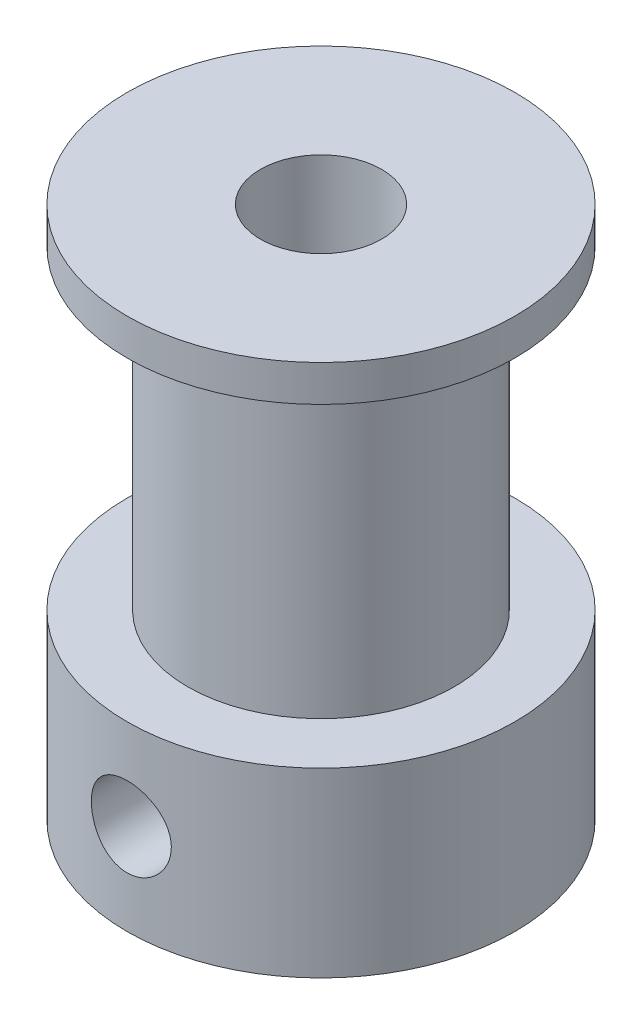
ISO-10303-21;
HEADER;
FILE_DESCRIPTION(('STEP AP214'),'2;1');
FILE_NAME('part.step','',(''),(''),'','','');
FILE_SCHEMA(('AUTOMOTIVE_DESIGN { 1 0 10303 214 1 1 1 1 }'));
ENDSEC;
DATA;
#1=APPLICATION_CONTEXT('core data for automotive mechanical design processes');
#2=APPLICATION_PROTOCOL_DEFINITION('international standard','automotive_design',2000,#1);
#3=PRODUCT_CONTEXT('',#1,'mechanical');
#4=PRODUCT('Part','Part','',(#3));
#5=PRODUCT_RELATED_PRODUCT_CATEGORY('part','',(#4));
#6=PRODUCT_DEFINITION_FORMATION('','',#4);
#7=PRODUCT_DEFINITION_CONTEXT('part definition',#1,'design');
#8=PRODUCT_DEFINITION('design','',#6,#7);
#9=PRODUCT_DEFINITION_SHAPE('','',#8);
#10=(LENGTH_UNIT() NAMED_UNIT(*) SI_UNIT(.MILLI.,.METRE.));
#11=(NAMED_UNIT(*) PLANE_ANGLE_UNIT() SI_UNIT($,.RADIAN.));
#12=(NAMED_UNIT(*) SI_UNIT($,.STERADIAN.) SOLID_ANGLE_UNIT());
#13=UNCERTAINTY_MEASURE_WITH_UNIT(LENGTH_MEASURE(1.E-05),#10,'distance_accuracy_value','');
#14=(GEOMETRIC_REPRESENTATION_CONTEXT(3) GLOBAL_UNCERTAINTY_ASSIGNED_CONTEXT((#13)) GLOBAL_UNIT_ASSIGNED_CONTEXT((#10,
#11,#12)) REPRESENTATION_CONTEXT('',''));
#15=CARTESIAN_POINT('',(0.,0.,0.));
#16=DIRECTION('',(0.,0.,1.));
#17=DIRECTION('',(1.,0.,0.));
#18=AXIS2_PLACEMENT_3D('',#15,#16,#17);
#19=CARTESIAN_POINT('',(0.,0.,0.));
#20=DIRECTION('',(0.,-1.,0.));
#21=DIRECTION('',(0.,0.,-1.));
#22=AXIS2_PLACEMENT_3D('',#19,#20,#21);
#23=CYLINDRICAL_SURFACE('',#22,2.5);
#24=CARTESIAN_POINT('',(-1.8781639970993,3.75,-1.65));
#25=CARTESIAN_POINT('',(-1.87817356740867,3.83079427655975,-1.64999443072167));
#26=CARTESIAN_POINT('',(-1.88347418282792,3.91162636905579,-1.64401449371116));
#27=CARTESIAN_POINT('',(-1.90365752241832,4.07041795060532,-1.62058860250623));
#28=CARTESIAN_POINT('',(-1.9185574504896,4.14837201591593,-1.60312206083479));
#29=CARTESIAN_POINT('',(-1.95530612756548,4.29863333158224,-1.55807727538571));
#30=CARTESIAN_POINT('',(-1.97708883218856,4.37098643150526,-1.53059477126484));
#31=CARTESIAN_POINT('',(-2.02503214275444,4.50994524738078,-1.46657517741326));
#32=CARTESIAN_POINT('',(-2.05119370638084,4.57654970122849,-1.43003610611276));
#33=CARTESIAN_POINT('',(-2.10971828562918,4.71321736687682,-1.342483593019));
#34=CARTESIAN_POINT('',(-2.14241946389367,4.78226727651007,-1.29011420470095));
#35=CARTESIAN_POINT('',(-2.20758221587981,4.91147714614391,-1.17514144468482));
#36=CARTESIAN_POINT('',(-2.24004353252863,4.97162860029669,-1.11252840012499));
#37=CARTESIAN_POINT('',(-2.3064419767716,5.08973271619889,-0.968234915676898));
#38=CARTESIAN_POINT('',(-2.33994640603816,5.14619090363769,-0.885111648041923));
#39=CARTESIAN_POINT('',(-2.39949293751456,5.24384115428655,-0.707908997031479));
#40=CARTESIAN_POINT('',(-2.42554320107045,5.28504992824281,-0.613841755901943));
#41=CARTESIAN_POINT('',(-2.46464353514927,5.34607361226671,-0.428365536633289));
#42=CARTESIAN_POINT('',(-2.47881191391302,5.36774914948944,-0.337811072451694));
#43=CARTESIAN_POINT('',(-2.49700266516609,5.39549014711654,-0.153380704926467));
#44=CARTESIAN_POINT('',(-2.50103745363967,5.40157471024375,-0.0595090091735763));
#45=CARTESIAN_POINT('',(-2.49868729659539,5.39800862462096,0.113712663637896));
#46=CARTESIAN_POINT('',(-2.49376656842582,5.39056933208685,0.193140500290932));
#47=CARTESIAN_POINT('',(-2.47671798966374,5.36453692457822,0.3493383081911));
#48=CARTESIAN_POINT('',(-2.46458960851095,5.3459429885018,0.426108083336214));
#49=CARTESIAN_POINT('',(-2.4341916732427,5.29858528412734,0.574862419576148));
#50=CARTESIAN_POINT('',(-2.41593946394568,5.26985022722838,0.646859815580448));
#51=CARTESIAN_POINT('',(-2.37464804586783,5.20331789592823,0.785017034503281));
#52=CARTESIAN_POINT('',(-2.35160793342518,5.16551891060689,0.851175752075152));
#53=CARTESIAN_POINT('',(-2.29902245001357,5.07644819163509,0.985047000791305));
#54=CARTESIAN_POINT('',(-2.26902056419845,5.02406230137878,1.05183695764555));
#55=CARTESIAN_POINT('',(-2.2070921891754,4.91019022775838,1.17625968695307));
#56=CARTESIAN_POINT('',(-2.17516278943165,4.84869006733423,1.2338781079658));
#57=CARTESIAN_POINT('',(-2.10711048312635,4.70750690257425,1.34724934289721));
#58=CARTESIAN_POINT('',(-2.07108428413496,4.62648069757491,1.40139996434746));
#59=CARTESIAN_POINT('',(-2.00437957659369,4.45447022283534,1.49525229324492));
#60=CARTESIAN_POINT('',(-1.973691925336,4.3635034211415,1.53497883258691));
#61=CARTESIAN_POINT('',(-1.93021206234819,4.20004901179961,1.58906609884216));
#62=CARTESIAN_POINT('',(-1.91481376393407,4.12958306194073,1.60742065844977));
#63=CARTESIAN_POINT('',(-1.89156962487726,3.98568483824098,1.63471528383588));
#64=CARTESIAN_POINT('',(-1.88371114115,3.91225774603094,1.64367111218457));
#65=CARTESIAN_POINT('',(-1.8767563549997,3.76413898103529,1.65161100823904));
#66=CARTESIAN_POINT('',(-1.87769482426888,3.68944345582033,1.65055550398266));
#67=CARTESIAN_POINT('',(-1.88825914723377,3.54146670785288,1.6384550878589));
#68=CARTESIAN_POINT('',(-1.89789215655036,3.46818670082213,1.62740194790476));
#69=CARTESIAN_POINT('',(-1.92377320788271,3.32815606994752,1.59670654181037));
#70=CARTESIAN_POINT('',(-1.9397182942886,3.2612601566981,1.57745493961547));
#71=CARTESIAN_POINT('',(-1.97637475195715,3.13158821030647,1.53127715983157));
#72=CARTESIAN_POINT('',(-1.99708770330354,3.06881355184297,1.50434843731628));
#73=CARTESIAN_POINT('',(-2.04592024038531,2.93584653371123,1.43744371796295));
#74=CARTESIAN_POINT('',(-2.0746933834994,2.86666627761783,1.3959374151933));
#75=CARTESIAN_POINT('',(-2.13386307226145,2.7354540035836,1.30370192953132));
#76=CARTESIAN_POINT('',(-2.16426156090022,2.67343083426984,1.2529615255776));
#77=CARTESIAN_POINT('',(-2.23066104299162,2.54502279309446,1.13132559349666));
#78=CARTESIAN_POINT('',(-2.26650752858329,2.48042825569478,1.0584336843705));
#79=CARTESIAN_POINT('',(-2.33354741548986,2.36429294484174,0.901029136145231));
#80=CARTESIAN_POINT('',(-2.36474520160667,2.31273983785047,0.816527594120796));
#81=CARTESIAN_POINT('',(-2.41383928477658,2.23346296196824,0.655022436944606));
#82=CARTESIAN_POINT('',(-2.43314294605933,2.20305320616478,0.579766982761486));
#83=CARTESIAN_POINT('',(-2.46500344203446,2.15340770004291,0.424305717798088));
#84=CARTESIAN_POINT('',(-2.47756592552064,2.13416259316718,0.344104114697705));
#85=CARTESIAN_POINT('',(-2.49483359194805,2.10780779187866,0.180532057501463));
#86=CARTESIAN_POINT('',(-2.49950622522129,2.10074836698325,0.097149920346795));
#87=CARTESIAN_POINT('',(-2.50041880991432,2.09936521725825,-0.0697703046886511));
#88=CARTESIAN_POINT('',(-2.49665914509096,2.10504091284884,-0.153308385299508));
#89=CARTESIAN_POINT('',(-2.48162224491363,2.12795948175331,-0.312248842068671));
#90=CARTESIAN_POINT('',(-2.47086791156197,2.14439826797345,-0.387820405838241));
#91=CARTESIAN_POINT('',(-2.44325497490618,2.18722616352496,-0.534890956581204));
#92=CARTESIAN_POINT('',(-2.4263954123254,2.21361683656131,-0.606389301510794));
#93=CARTESIAN_POINT('',(-2.38659098522815,2.27725696718865,-0.748299731070004));
#94=CARTESIAN_POINT('',(-2.36333062488106,2.31508395318078,-0.818362050887263));
#95=CARTESIAN_POINT('',(-2.31298664760703,2.39960758414193,-0.951399734920286));
#96=CARTESIAN_POINT('',(-2.2859005630314,2.44630996063965,-1.0143704774724));
#97=CARTESIAN_POINT('',(-2.22528132748969,2.55552907515258,-1.14186276834819));
#98=CARTESIAN_POINT('',(-2.19140310364951,2.61937720174746,-1.20508031729177));
#99=CARTESIAN_POINT('',(-2.12387294022856,2.75656834044152,-1.32046767601713));
#100=CARTESIAN_POINT('',(-2.09022116132146,2.82991747200145,-1.37263030790415));
#101=CARTESIAN_POINT('',(-2.02963185186414,2.97797320198263,-1.46053735742483));
#102=CARTESIAN_POINT('',(-2.00236030827309,3.05189495776457,-1.49736813204505));
#103=CARTESIAN_POINT('',(-1.95397052678841,3.20610913288329,-1.55999123252305));
#104=CARTESIAN_POINT('',(-1.93283919103843,3.28638751989308,-1.58580711054237));
#105=CARTESIAN_POINT('',(-1.90415675714691,3.4306913968137,-1.62004735146957));
#106=CARTESIAN_POINT('',(-1.89451740482451,3.49364690760695,-1.63122690692698));
#107=CARTESIAN_POINT('',(-1.88151889606352,3.62106080182247,-1.64620346660995));
#108=CARTESIAN_POINT('',(-1.8781563590673,3.68551835732424,-1.65000444482246));
#109=CARTESIAN_POINT('',(-1.8781639970993,3.75,-1.65));
#110=B_SPLINE_CURVE_WITH_KNOTS('',3,(#24,#25,#26,#27,#28,#29,#30,#31,#32,#33,#34,#35,#36,#37,
#38,#39,#40,#41,#42,#43,#44,#45,#46,#47,#48,#49,#50,#51,#52,#53,#54,#55,#56,#57,#58,#59,#60,#61,
#62,#63,#64,#65,#66,#67,#68,#69,#70,#71,#72,#73,#74,#75,#76,#77,#78,#79,#80,#81,#82,#83,#84,#85,
#86,#87,#88,#89,#90,#91,#92,#93,#94,#95,#96,#97,#98,#99,#100,#101,#102,#103,#104,#105,#106,#107,
#108,#109),.UNSPECIFIED.,.T.,.F.,(4,2,2,2,2,2,2,2,2,2,2,2,2,2,2,2,2,2,2,2,2,2,2,2,2,2,2,2,2,2,2,
2,2,2,2,2,2,2,2,2,2,2,4),(0.,0.242089089232209,0.484613262365225,0.724877542229117,
0.965194438206265,1.24204242334406,1.5191533550871,1.83517136959404,2.1508420497088,
2.43163690958526,2.71208756281942,2.95071293244789,3.18935586962917,3.42732851395789,
3.66534611375403,3.93440451568683,4.20387988176699,4.51414003592554,4.82386349786489,
5.04625677123859,5.26827647088753,5.49117411610792,5.71425537389902,5.92772322794784,
6.14126192794924,6.39732261532281,6.65369656488882,6.9635657507811,7.27314078239636,
7.52238413686408,7.77141830954321,8.02147738775785,8.27152508592672,8.50474641601316,
8.73800440662634,8.98590102363144,9.23395827408608,9.52089661145361,9.80802068929721,
10.067982581361,10.327385800336,10.5207004402689,10.713910935025),.UNSPECIFIED.);
#111=CARTESIAN_POINT('',(-1.8781639970993,3.75,-1.65));
#112=VERTEX_POINT('',#111);
#113=EDGE_CURVE('E124',#112,#112,#110,.T.);
#114=ORIENTED_EDGE('',*,*,#113,.F.);
#115=EDGE_LOOP('',(#114));
#116=FACE_BOUND('',#115,.T.);
#117=CARTESIAN_POINT('',(-1.64999999999999,3.75,1.8781639970993));
#118=CARTESIAN_POINT('',(-1.64999443072166,3.83079427655975,1.87817356740867));
#119=CARTESIAN_POINT('',(-1.64401449371115,3.91162636905579,1.88347418282793));
#120=CARTESIAN_POINT('',(-1.62058860250622,4.07041795060532,1.90365752241832));
#121=CARTESIAN_POINT('',(-1.60312206083479,4.14837201591593,1.91855745048961));
#122=CARTESIAN_POINT('',(-1.5580772753857,4.29863333158224,1.95530612756548));
#123=CARTESIAN_POINT('',(-1.53059477126484,4.37098643150526,1.97708883218856));
#124=CARTESIAN_POINT('',(-1.46657517741325,4.50994524738078,2.02503214275445));
#125=CARTESIAN_POINT('',(-1.43003610611276,4.57654970122849,2.05119370638085));
#126=CARTESIAN_POINT('',(-1.34248359301899,4.71321736687682,2.10971828562919));
#127=CARTESIAN_POINT('',(-1.29011420470094,4.78226727651007,2.14241946389367));
#128=CARTESIAN_POINT('',(-1.17514144468481,4.91147714614391,2.20758221587982));
#129=CARTESIAN_POINT('',(-1.11252840012498,4.97162860029669,2.24004353252863));
#130=CARTESIAN_POINT('',(-0.968234915676889,5.08973271619889,2.3064419767716));
#131=CARTESIAN_POINT('',(-0.885111648041913,5.14619090363769,2.33994640603817));
#132=CARTESIAN_POINT('',(-0.707908997031469,5.24384115428655,2.39949293751456));
#133=CARTESIAN_POINT('',(-0.613841755901935,5.28504992824281,2.42554320107045));
#134=CARTESIAN_POINT('',(-0.42836553663328,5.34607361226671,2.46464353514927));
#135=CARTESIAN_POINT('',(-0.337811072451686,5.36774914948944,2.47881191391302));
#136=CARTESIAN_POINT('',(-0.153380704926459,5.39549014711654,2.49700266516609));
#137=CARTESIAN_POINT('',(-0.0595090091735682,5.40157471024375,2.50103745363967));
#138=CARTESIAN_POINT('',(0.113712663637904,5.39800862462096,2.49868729659539));
#139=CARTESIAN_POINT('',(0.19314050029094,5.39056933208685,2.49376656842582));
#140=CARTESIAN_POINT('',(0.349338308191108,5.36453692457822,2.47671798966374));
#141=CARTESIAN_POINT('',(0.426108083336222,5.3459429885018,2.46458960851095));
#142=CARTESIAN_POINT('',(0.574862419576156,5.29858528412734,2.4341916732427));
#143=CARTESIAN_POINT('',(0.646859815580457,5.26985022722838,2.41593946394568));
#144=CARTESIAN_POINT('',(0.78501703450329,5.20331789592823,2.37464804586783));
#145=CARTESIAN_POINT('',(0.85117575207516,5.16551891060689,2.35160793342517));
#146=CARTESIAN_POINT('',(0.985047000791313,5.07644819163509,2.29902245001356));
#147=CARTESIAN_POINT('',(1.05183695764556,5.02406230137878,2.26902056419845));
#148=CARTESIAN_POINT('',(1.17625968695308,4.91019022775838,2.20709218917539));
#149=CARTESIAN_POINT('',(1.23387810796581,4.84869006733423,2.17516278943164));
#150=CARTESIAN_POINT('',(1.34724934289721,4.70750690257425,2.10711048312634));
#151=CARTESIAN_POINT('',(1.40139996434747,4.62648069757491,2.07108428413495));
#152=CARTESIAN_POINT('',(1.49525229324493,4.45447022283534,2.00437957659369));
#153=CARTESIAN_POINT('',(1.53497883258691,4.3635034211415,1.973691925336));
#154=CARTESIAN_POINT('',(1.58906609884217,4.20004901179961,1.93021206234819));
#155=CARTESIAN_POINT('',(1.60742065844978,4.12958306194073,1.91481376393406));
#156=CARTESIAN_POINT('',(1.63471528383588,3.98568483824098,1.89156962487725));
#157=CARTESIAN_POINT('',(1.64367111218458,3.91225774603094,1.88371114115));
#158=CARTESIAN_POINT('',(1.65161100823905,3.76413898103529,1.8767563549997));
#159=CARTESIAN_POINT('',(1.65055550398267,3.68944345582033,1.87769482426888));
#160=CARTESIAN_POINT('',(1.63845508785891,3.54146670785288,1.88825914723377));
#161=CARTESIAN_POINT('',(1.62740194790476,3.46818670082213,1.89789215655035));
#162=CARTESIAN_POINT('',(1.59670654181038,3.32815606994752,1.92377320788271));
#163=CARTESIAN_POINT('',(1.57745493961548,3.2612601566981,1.9397182942886));
#164=CARTESIAN_POINT('',(1.53127715983158,3.13158821030647,1.97637475195714));
#165=CARTESIAN_POINT('',(1.50434843731629,3.06881355184297,1.99708770330354));
#166=CARTESIAN_POINT('',(1.43744371796296,2.93584653371123,2.0459202403853));
#167=CARTESIAN_POINT('',(1.39593741519331,2.86666627761783,2.07469338349939));
#168=CARTESIAN_POINT('',(1.30370192953132,2.7354540035836,2.13386307226145));
#169=CARTESIAN_POINT('',(1.25296152557761,2.67343083426984,2.16426156090021));
#170=CARTESIAN_POINT('',(1.13132559349666,2.54502279309446,2.23066104299161));
#171=CARTESIAN_POINT('',(1.0584336843705,2.48042825569478,2.26650752858329));
#172=CARTESIAN_POINT('',(0.901029136145239,2.36429294484174,2.33354741548986));
#173=CARTESIAN_POINT('',(0.816527594120804,2.31273983785047,2.36474520160667));
#174=CARTESIAN_POINT('',(0.655022436944614,2.23346296196824,2.41383928477658));
#175=CARTESIAN_POINT('',(0.579766982761494,2.20305320616478,2.43314294605933));
#176=CARTESIAN_POINT('',(0.424305717798096,2.15340770004291,2.46500344203446));
#177=CARTESIAN_POINT('',(0.344104114697714,2.13416259316718,2.47756592552063));
#178=CARTESIAN_POINT('',(0.180532057501472,2.10780779187866,2.49483359194805));
#179=CARTESIAN_POINT('',(0.097149920346804,2.10074836698325,2.49950622522129));
#180=CARTESIAN_POINT('',(-0.0697703046886418,2.09936521725825,2.50041880991432));
#181=CARTESIAN_POINT('',(-0.153308385299498,2.10504091284884,2.49665914509096));
#182=CARTESIAN_POINT('',(-0.312248842068662,2.12795948175331,2.48162224491364));
#183=CARTESIAN_POINT('',(-0.387820405838232,2.14439826797345,2.47086791156197));
#184=CARTESIAN_POINT('',(-0.534890956581195,2.18722616352496,2.44325497490618));
#185=CARTESIAN_POINT('',(-0.606389301510785,2.21361683656131,2.42639541232541));
#186=CARTESIAN_POINT('',(-0.748299731069995,2.27725696718865,2.38659098522815));
#187=CARTESIAN_POINT('',(-0.818362050887254,2.31508395318078,2.36333062488106));
#188=CARTESIAN_POINT('',(-0.951399734920278,2.39960758414193,2.31298664760704));
#189=CARTESIAN_POINT('',(-1.01437047747239,2.44630996063965,2.2859005630314));
#190=CARTESIAN_POINT('',(-1.14186276834818,2.55552907515258,2.2252813274897));
#191=CARTESIAN_POINT('',(-1.20508031729177,2.61937720174746,2.19140310364951));
#192=CARTESIAN_POINT('',(-1.32046767601712,2.75656834044152,2.12387294022856));
#193=CARTESIAN_POINT('',(-1.37263030790415,2.82991747200145,2.09022116132146));
#194=CARTESIAN_POINT('',(-1.46053735742482,2.97797320198263,2.02963185186414));
#195=CARTESIAN_POINT('',(-1.49736813204505,3.05189495776457,2.00236030827309));
#196=CARTESIAN_POINT('',(-1.55999123252304,3.20610913288329,1.95397052678842));
#197=CARTESIAN_POINT('',(-1.58580711054236,3.28638751989308,1.93283919103844));
#198=CARTESIAN_POINT('',(-1.62004735146956,3.4306913968137,1.90415675714692));
#199=CARTESIAN_POINT('',(-1.63122690692697,3.49364690760695,1.89451740482452));
#200=CARTESIAN_POINT('',(-1.64620346660994,3.62106080182247,1.88151889606352));
#201=CARTESIAN_POINT('',(-1.65000444482246,3.68551835732424,1.87815635906731));
#202=CARTESIAN_POINT('',(-1.64999999999999,3.75,1.8781639970993));
#203=B_SPLINE_CURVE_WITH_KNOTS('',3,(#117,#118,#119,#120,#121,#122,#123,#124,#125,#126,#127,
#128,#129,#130,#131,#132,#133,#134,#135,#136,#137,#138,#139,#140,#141,#142,#143,#144,#145,#146,
#147,#148,#149,#150,#151,#152,#153,#154,#155,#156,#157,#158,#159,#160,#161,#162,#163,#164,#165,
#166,#167,#168,#169,#170,#171,#172,#173,#174,#175,#176,#177,#178,#179,#180,#181,#182,#183,#184,
#185,#186,#187,#188,#189,#190,#191,#192,#193,#194,#195,#196,#197,#198,#199,#200,#201,#202),
.UNSPECIFIED.,.T.,.F.,(4,2,2,2,2,2,2,2,2,2,2,2,2,2,2,2,2,2,2,2,2,2,2,2,2,2,2,2,2,2,2,2,2,2,2,2,
2,2,2,2,2,2,4),(0.,0.242089089232209,0.484613262365225,0.724877542229118,0.965194438206265,
1.24204242334406,1.5191533550871,1.83517136959404,2.1508420497088,2.43163690958526,
2.71208756281942,2.95071293244789,3.18935586962917,3.42732851395789,3.66534611375403,
3.93440451568683,4.20387988176699,4.51414003592554,4.82386349786489,5.04625677123858,
5.26827647088753,5.49117411610791,5.71425537389902,5.92772322794784,6.14126192794924,
6.39732261532281,6.65369656488882,6.9635657507811,7.27314078239636,7.52238413686408,
7.77141830954321,8.02147738775785,8.27152508592672,8.50474641601316,8.73800440662634,
8.98590102363144,9.23395827408608,9.52089661145361,9.80802068929721,10.067982581361,
10.327385800336,10.5207004402689,10.713910935025),.UNSPECIFIED.);
#204=CARTESIAN_POINT('',(-1.64999999999999,3.75,1.8781639970993));
#205=VERTEX_POINT('',#204);
#206=EDGE_CURVE('E66',#205,#205,#203,.T.);
#207=ORIENTED_EDGE('',*,*,#206,.F.);
#208=EDGE_LOOP('',(#207));
#209=FACE_BOUND('',#208,.T.);
#210=CARTESIAN_POINT('',(0.,0.,0.));
#211=DIRECTION('',(0.,-1.,0.));
#212=DIRECTION('',(0.,0.,-1.));
#213=AXIS2_PLACEMENT_3D('',#210,#211,#212);
#214=CIRCLE('',#213,2.5);
#215=CARTESIAN_POINT('',(0.,0.,-2.5));
#216=VERTEX_POINT('',#215);
#217=EDGE_CURVE('E63',#216,#216,#214,.T.);
#218=ORIENTED_EDGE('',*,*,#217,.T.);
#219=EDGE_LOOP('',(#218));
#220=FACE_BOUND('',#219,.T.);
#221=CARTESIAN_POINT('',(0.,22.,0.));
#222=DIRECTION('',(0.,-1.,0.));
#223=DIRECTION('',(0.,0.,-1.));
#224=AXIS2_PLACEMENT_3D('',#221,#222,#223);
#225=CIRCLE('',#224,2.5);
#226=CARTESIAN_POINT('',(0.,22.,-2.5));
#227=VERTEX_POINT('',#226);
#228=EDGE_CURVE('E10',#227,#227,#225,.T.);
#229=ORIENTED_EDGE('',*,*,#228,.F.);
#230=EDGE_LOOP('',(#229));
#231=FACE_BOUND('',#230,.T.);
#232=ADVANCED_FACE('F34',(#116,#209,#220,#231),#23,.F.);
#233=CARTESIAN_POINT('',(2.5,22.,0.));
#234=DIRECTION('',(0.,1.,0.));
#235=DIRECTION('',(0.,0.,1.));
#236=AXIS2_PLACEMENT_3D('',#233,#234,#235);
#237=PLANE('',#236);
#238=ORIENTED_EDGE('',*,*,#228,.T.);
#239=EDGE_LOOP('',(#238));
#240=FACE_BOUND('',#239,.T.);
#241=CARTESIAN_POINT('',(0.,22.,0.));
#242=DIRECTION('',(0.,-1.,0.));
#243=DIRECTION('',(0.,0.,-1.));
#244=AXIS2_PLACEMENT_3D('',#241,#242,#243);
#245=CIRCLE('',#244,8.);
#246=CARTESIAN_POINT('',(0.,22.,-8.));
#247=VERTEX_POINT('',#246);
#248=EDGE_CURVE('E41',#247,#247,#245,.T.);
#249=ORIENTED_EDGE('',*,*,#248,.F.);
#250=EDGE_LOOP('',(#249));
#251=FACE_BOUND('',#250,.T.);
#252=ADVANCED_FACE('F112',(#240,#251),#237,.T.);
#253=CARTESIAN_POINT('',(0.,0.,0.));
#254=DIRECTION('',(0.,-1.,0.));
#255=DIRECTION('',(0.,0.,-1.));
#256=AXIS2_PLACEMENT_3D('',#253,#254,#255);
#257=CYLINDRICAL_SURFACE('',#256,8.);
#258=ORIENTED_EDGE('',*,*,#248,.T.);
#259=EDGE_LOOP('',(#258));
#260=FACE_BOUND('',#259,.T.);
#261=CARTESIAN_POINT('',(0.,20.5,0.));
#262=DIRECTION('',(0.,-1.,0.));
#263=DIRECTION('',(0.,0.,-1.));
#264=AXIS2_PLACEMENT_3D('',#261,#262,#263);
#265=CIRCLE('',#264,8.);
#266=CARTESIAN_POINT('',(0.,20.5,-8.));
#267=VERTEX_POINT('',#266);
#268=EDGE_CURVE('E45',#267,#267,#265,.T.);
#269=ORIENTED_EDGE('',*,*,#268,.F.);
#270=EDGE_LOOP('',(#269));
#271=FACE_BOUND('',#270,.T.);
#272=ADVANCED_FACE('F109',(#260,#271),#257,.T.);
#273=CARTESIAN_POINT('',(8.,20.5,0.));
#274=DIRECTION('',(0.,-1.,0.));
#275=DIRECTION('',(0.,0.,-1.));
#276=AXIS2_PLACEMENT_3D('',#273,#274,#275);
#277=PLANE('',#276);
#278=ORIENTED_EDGE('',*,*,#268,.T.);
#279=EDGE_LOOP('',(#278));
#280=FACE_BOUND('',#279,.T.);
#281=CARTESIAN_POINT('',(0.,20.5,0.));
#282=DIRECTION('',(0.,-1.,0.));
#283=DIRECTION('',(0.,0.,-1.));
#284=AXIS2_PLACEMENT_3D('',#281,#282,#283);
#285=CIRCLE('',#284,5.5);
#286=CARTESIAN_POINT('',(0.,20.5,-5.5));
#287=VERTEX_POINT('',#286);
#288=EDGE_CURVE('E49',#287,#287,#285,.T.);
#289=ORIENTED_EDGE('',*,*,#288,.F.);
#290=EDGE_LOOP('',(#289));
#291=FACE_BOUND('',#290,.T.);
#292=ADVANCED_FACE('F105',(#280,#291),#277,.T.);
#293=CARTESIAN_POINT('',(0.,0.,0.));
#294=DIRECTION('',(0.,-1.,0.));
#295=DIRECTION('',(0.,0.,-1.));
#296=AXIS2_PLACEMENT_3D('',#293,#294,#295);
#297=CYLINDRICAL_SURFACE('',#296,5.5);
#298=ORIENTED_EDGE('',*,*,#288,.T.);
#299=EDGE_LOOP('',(#298));
#300=FACE_BOUND('',#299,.T.);
#301=CARTESIAN_POINT('',(0.,7.5,0.));
#302=DIRECTION('',(0.,-1.,0.));
#303=DIRECTION('',(0.,0.,-1.));
#304=AXIS2_PLACEMENT_3D('',#301,#302,#303);
#305=CIRCLE('',#304,5.5);
#306=CARTESIAN_POINT('',(0.,7.5,-5.5));
#307=VERTEX_POINT('',#306);
#308=EDGE_CURVE('E54',#307,#307,#305,.T.);
#309=ORIENTED_EDGE('',*,*,#308,.F.);
#310=EDGE_LOOP('',(#309));
#311=FACE_BOUND('',#310,.T.);
#312=ADVANCED_FACE('F101',(#300,#311),#297,.T.);
#313=CARTESIAN_POINT('',(5.5,7.5,0.));
#314=DIRECTION('',(0.,1.,0.));
#315=DIRECTION('',(0.,0.,1.));
#316=AXIS2_PLACEMENT_3D('',#313,#314,#315);
#317=PLANE('',#316);
#318=ORIENTED_EDGE('',*,*,#308,.T.);
#319=EDGE_LOOP('',(#318));
#320=FACE_BOUND('',#319,.T.);
#321=CARTESIAN_POINT('',(0.,7.5,0.));
#322=DIRECTION('',(0.,-1.,0.));
#323=DIRECTION('',(0.,0.,-1.));
#324=AXIS2_PLACEMENT_3D('',#321,#322,#323);
#325=CIRCLE('',#324,8.);
#326=CARTESIAN_POINT('',(0.,7.5,-8.));
#327=VERTEX_POINT('',#326);
#328=EDGE_CURVE('E57',#327,#327,#325,.T.);
#329=ORIENTED_EDGE('',*,*,#328,.F.);
#330=EDGE_LOOP('',(#329));
#331=FACE_BOUND('',#330,.T.);
#332=ADVANCED_FACE('F97',(#320,#331),#317,.T.);
#333=CARTESIAN_POINT('',(0.,0.,0.));
#334=DIRECTION('',(0.,-1.,0.));
#335=DIRECTION('',(0.,0.,-1.));
#336=AXIS2_PLACEMENT_3D('',#333,#334,#335);
#337=CYLINDRICAL_SURFACE('',#336,8.);
#338=CARTESIAN_POINT('',(-7.82799463464303,3.75,-1.65000000000002));
#339=CARTESIAN_POINT('',(-7.82799647234762,3.65838265020587,-1.64999668532495));
#340=CARTESIAN_POINT('',(-7.82962054015776,3.56672418524715,-1.64234339972767));
#341=CARTESIAN_POINT('',(-7.83593102109728,3.38600463091418,-1.61196056082938));
#342=CARTESIAN_POINT('',(-7.84061980768031,3.29694561055349,-1.5892193225455));
#343=CARTESIAN_POINT('',(-7.85250661788931,3.12406550779537,-1.52939944297716));
#344=CARTESIAN_POINT('',(-7.85970206178507,3.04023914438723,-1.49233553761894));
#345=CARTESIAN_POINT('',(-7.8757883628587,2.87999539773513,-1.40496339378159));
#346=CARTESIAN_POINT('',(-7.88467914491256,2.80357768642445,-1.35465574212319));
#347=CARTESIAN_POINT('',(-7.90330366333984,2.65916869685439,-1.24141806188278));
#348=CARTESIAN_POINT('',(-7.91304715328143,2.59130499871953,-1.17832691131061));
#349=CARTESIAN_POINT('',(-7.93219354684102,2.46704538623968,-1.04166118718971));
#350=CARTESIAN_POINT('',(-7.9415964257225,2.41065030342433,-0.968085854144728));
#351=CARTESIAN_POINT('',(-7.95910768239297,2.31043057364174,-0.811692001393482));
#352=CARTESIAN_POINT('',(-7.9672032148807,2.26672764618193,-0.728793920101091));
#353=CARTESIAN_POINT('',(-7.98107786735649,2.19391889056577,-0.556636173632907));
#354=CARTESIAN_POINT('',(-7.98685721806651,2.16481160841992,-0.467377143134544));
#355=CARTESIAN_POINT('',(-7.99537941797959,2.12241888749503,-0.286356118265347));
#356=CARTESIAN_POINT('',(-7.9981636071457,2.10891784790325,-0.194646593521417));
#357=CARTESIAN_POINT('',(-8.00052470522147,2.09744772857828,-0.0102247919218537));
#358=CARTESIAN_POINT('',(-8.00010194196704,2.09947706122786,0.0824873814688405));
#359=CARTESIAN_POINT('',(-7.99612866013651,2.11884751190411,0.264799667160856));
#360=CARTESIAN_POINT('',(-7.99262559257093,2.13595634487907,0.354425644609033));
#361=CARTESIAN_POINT('',(-7.98293899531616,2.18463114642421,0.529506535845896));
#362=CARTESIAN_POINT('',(-7.97675535366161,2.21619771888529,0.614961275239523));
#363=CARTESIAN_POINT('',(-7.96232481023259,2.29310395969086,0.779930808135305));
#364=CARTESIAN_POINT('',(-7.9540644839743,2.338533669891,0.859402403191171));
#365=CARTESIAN_POINT('',(-7.93638961806162,2.44180981405783,1.00967984091352));
#366=CARTESIAN_POINT('',(-7.9269749376687,2.49965776269955,1.08048462481767));
#367=CARTESIAN_POINT('',(-7.90782396421891,2.62739949269513,1.21279807501822));
#368=CARTESIAN_POINT('',(-7.89808494418977,2.69749657601012,1.27411022634261));
#369=CARTESIAN_POINT('',(-7.87954771497238,2.84707704525908,1.38414252261931));
#370=CARTESIAN_POINT('',(-7.87074952591438,2.92656063195232,1.43286239817594));
#371=CARTESIAN_POINT('',(-7.85508413098619,3.09295154532296,1.51640121308691));
#372=CARTESIAN_POINT('',(-7.84822159457678,3.17987617555305,1.55118662114804));
#373=CARTESIAN_POINT('',(-7.83727167258976,3.35851110822587,1.60559987539901));
#374=CARTESIAN_POINT('',(-7.83318390018329,3.45022074167258,1.625229834457));
#375=CARTESIAN_POINT('',(-7.82832430034405,3.63403656452722,1.64847767759944));
#376=CARTESIAN_POINT('',(-7.82749355348185,3.72610524914936,1.65238010858403));
#377=CARTESIAN_POINT('',(-7.82908365669822,3.90957787369399,1.64482933127382));
#378=CARTESIAN_POINT('',(-7.83150430988349,4.00098185353166,1.63337705280602));
#379=CARTESIAN_POINT('',(-7.83926913983494,4.17956292570631,1.59568777426683));
#380=CARTESIAN_POINT('',(-7.84458293687797,4.26677386630953,1.56960432546505));
#381=CARTESIAN_POINT('',(-7.85750843647709,4.43558776326281,1.50355797289369));
#382=CARTESIAN_POINT('',(-7.86512033846231,4.51719023215592,1.46359386451762));
#383=CARTESIAN_POINT('',(-7.88191579950282,4.67371145184227,1.37028211396983));
#384=CARTESIAN_POINT('',(-7.89111960565472,4.74852237549567,1.31675731908656));
#385=CARTESIAN_POINT('',(-7.91000699478187,4.88820452380131,1.19807829347329));
#386=CARTESIAN_POINT('',(-7.91969063034349,4.95307465580095,1.13292278604277));
#387=CARTESIAN_POINT('',(-7.93863877717958,5.07212093769425,0.991551131023601));
#388=CARTESIAN_POINT('',(-7.94789380519354,5.12610416985807,0.915171051258559));
#389=CARTESIAN_POINT('',(-7.96477402593326,5.22047228277745,0.754260738130238));
#390=CARTESIAN_POINT('',(-7.97239928979604,5.26085775710129,0.669730860728551));
#391=CARTESIAN_POINT('',(-7.98512048804082,5.32660680591843,0.495414150876506));
#392=CARTESIAN_POINT('',(-7.99023131933467,5.35205903076799,0.405661891513242));
#393=CARTESIAN_POINT('',(-7.99741186635558,5.38749875247808,0.223039444294558));
#394=CARTESIAN_POINT('',(-7.99948197278733,5.39748823616509,0.130169658580893));
#395=CARTESIAN_POINT('',(-8.00033781964049,5.40163792775637,-0.0542126492056026));
#396=CARTESIAN_POINT('',(-7.99918360281958,5.39608751248278,-0.145718502140327));
#397=CARTESIAN_POINT('',(-7.99384751004402,5.36995660490955,-0.326463478938195));
#398=CARTESIAN_POINT('',(-7.98966567723012,5.34937632677157,-0.415702635080925));
#399=CARTESIAN_POINT('',(-7.97874682116246,5.2939018588418,-0.589186560182823));
#400=CARTESIAN_POINT('',(-7.97201637401338,5.259044489013,-0.673443542985833));
#401=CARTESIAN_POINT('',(-7.95672300876336,5.17604295789362,-0.834953513276977));
#402=CARTESIAN_POINT('',(-7.9481599348062,5.12789766642748,-0.912205904261804));
#403=CARTESIAN_POINT('',(-7.92995681960444,5.01872135471439,-1.05893847166516));
#404=CARTESIAN_POINT('',(-7.92030089151862,4.95748443024996,-1.12826349061001));
#405=CARTESIAN_POINT('',(-7.90109178015231,4.82428375835354,-1.25575285452555));
#406=CARTESIAN_POINT('',(-7.89153862187156,4.75231746145462,-1.31391453937946));
#407=CARTESIAN_POINT('',(-7.87349423401939,4.5986988961721,-1.41807001635076));
#408=CARTESIAN_POINT('',(-7.86501660134749,4.51694399769159,-1.46391490783106));
#409=CARTESIAN_POINT('',(-7.85025069483304,4.34673711383086,-1.54114313624578));
#410=CARTESIAN_POINT('',(-7.84396047891661,4.2582911544332,-1.57253930936732));
#411=CARTESIAN_POINT('',(-7.83550744278865,4.09973277569769,-1.6140462079898));
#412=CARTESIAN_POINT('',(-7.83270799535493,4.03051105159897,-1.6275042042483));
#413=CARTESIAN_POINT('',(-7.82895092043294,3.89086762345535,-1.64548220150441));
#414=CARTESIAN_POINT('',(-7.82799322160417,3.82044596599671,-1.65000254870381));
#415=CARTESIAN_POINT('',(-7.82799463464303,3.75,-1.65000000000002));
#416=B_SPLINE_CURVE_WITH_KNOTS('',3,(#338,#339,#340,#341,#342,#343,#344,#345,#346,#347,#348,
#349,#350,#351,#352,#353,#354,#355,#356,#357,#358,#359,#360,#361,#362,#363,#364,#365,#366,#367,
#368,#369,#370,#371,#372,#373,#374,#375,#376,#377,#378,#379,#380,#381,#382,#383,#384,#385,#386,
#387,#388,#389,#390,#391,#392,#393,#394,#395,#396,#397,#398,#399,#400,#401,#402,#403,#404,#405,
#406,#407,#408,#409,#410,#411,#412,#413,#414,#415),.UNSPECIFIED.,.T.,.F.,(4,2,2,2,2,2,2,2,2,2,2,
2,2,2,2,2,2,2,2,2,2,2,2,2,2,2,2,2,2,2,2,2,2,2,2,2,2,2,4),(0.,0.27459403698175,0.549400984088785,
0.82392594465762,1.09843874327276,1.3766547467594,1.65489091505464,1.93571338943597,
2.21650788327397,2.49337499570617,2.77021380533169,3.04286128513493,3.31552015429503,
3.58998907522695,3.86449149267072,4.14407920367273,4.4236728956019,4.70393540521657,
4.9841588355065,5.25928898855093,5.53440248143716,5.80668132243981,6.07898379854718,
6.35504561674318,6.6311377568341,6.91175972338565,7.1923694386602,7.47129602001294,
7.75018675877315,8.02391884651822,8.29764703391013,8.57067368982019,8.84372357458458,
9.1214337806041,9.39921008040027,9.68020708192079,9.96095396255218,10.1721016499172,
10.38324115827),.UNSPECIFIED.);
#417=CARTESIAN_POINT('',(-7.82799463464303,3.75,-1.65000000000002));
#418=VERTEX_POINT('',#417);
#419=EDGE_CURVE('E134',#418,#418,#416,.T.);
#420=ORIENTED_EDGE('',*,*,#419,.F.);
#421=EDGE_LOOP('',(#420));
#422=FACE_BOUND('',#421,.T.);
#423=CARTESIAN_POINT('',(-1.64999999999999,3.75,7.82799463464303));
#424=CARTESIAN_POINT('',(-1.64999668532493,3.65838265020587,7.82799647234762));
#425=CARTESIAN_POINT('',(-1.64234339972764,3.56672418524715,7.82962054015777));
#426=CARTESIAN_POINT('',(-1.61196056082935,3.38600463091418,7.83593102109729));
#427=CARTESIAN_POINT('',(-1.58921932254547,3.29694561055349,7.84061980768031));
#428=CARTESIAN_POINT('',(-1.52939944297714,3.12406550779537,7.85250661788932));
#429=CARTESIAN_POINT('',(-1.49233553761891,3.04023914438723,7.85970206178508));
#430=CARTESIAN_POINT('',(-1.40496339378156,2.87999539773513,7.8757883628587));
#431=CARTESIAN_POINT('',(-1.35465574212316,2.80357768642445,7.88467914491256));
#432=CARTESIAN_POINT('',(-1.24141806188275,2.65916869685439,7.90330366333985));
#433=CARTESIAN_POINT('',(-1.17832691131059,2.59130499871953,7.91304715328143));
#434=CARTESIAN_POINT('',(-1.04166118718968,2.46704538623968,7.93219354684103));
#435=CARTESIAN_POINT('',(-0.9680858541447,2.41065030342433,7.94159642572251));
#436=CARTESIAN_POINT('',(-0.811692001393454,2.31043057364174,7.95910768239297));
#437=CARTESIAN_POINT('',(-0.728793920101063,2.26672764618193,7.9672032148807));
#438=CARTESIAN_POINT('',(-0.556636173632879,2.19391889056577,7.98107786735649));
#439=CARTESIAN_POINT('',(-0.467377143134516,2.16481160841992,7.98685721806651));
#440=CARTESIAN_POINT('',(-0.286356118265319,2.12241888749503,7.99537941797959));
#441=CARTESIAN_POINT('',(-0.194646593521389,2.10891784790325,7.9981636071457));
#442=CARTESIAN_POINT('',(-0.0102247919218259,2.09744772857828,8.00052470522147));
#443=CARTESIAN_POINT('',(0.0824873814688683,2.09947706122786,8.00010194196704));
#444=CARTESIAN_POINT('',(0.264799667160884,2.11884751190411,7.99612866013651));
#445=CARTESIAN_POINT('',(0.35442564460906,2.13595634487907,7.99262559257093));
#446=CARTESIAN_POINT('',(0.529506535845924,2.18463114642421,7.98293899531616));
#447=CARTESIAN_POINT('',(0.61496127523955,2.21619771888529,7.97675535366161));
#448=CARTESIAN_POINT('',(0.779930808135332,2.29310395969086,7.96232481023259));
#449=CARTESIAN_POINT('',(0.859402403191199,2.338533669891,7.95406448397429));
#450=CARTESIAN_POINT('',(1.00967984091354,2.44180981405783,7.93638961806162));
#451=CARTESIAN_POINT('',(1.08048462481769,2.49965776269955,7.9269749376687));
#452=CARTESIAN_POINT('',(1.21279807501824,2.62739949269513,7.9078239642189));
#453=CARTESIAN_POINT('',(1.27411022634264,2.69749657601012,7.89808494418977));
#454=CARTESIAN_POINT('',(1.38414252261934,2.84707704525908,7.87954771497238));
#455=CARTESIAN_POINT('',(1.43286239817597,2.92656063195232,7.87074952591437));
#456=CARTESIAN_POINT('',(1.51640121308694,3.09295154532296,7.85508413098618));
#457=CARTESIAN_POINT('',(1.55118662114807,3.17987617555305,7.84822159457677));
#458=CARTESIAN_POINT('',(1.60559987539903,3.35851110822587,7.83727167258975));
#459=CARTESIAN_POINT('',(1.62522983445702,3.45022074167258,7.83318390018328));
#460=CARTESIAN_POINT('',(1.64847767759947,3.63403656452722,7.82832430034405));
#461=CARTESIAN_POINT('',(1.65238010858406,3.72610524914936,7.82749355348184));
#462=CARTESIAN_POINT('',(1.64482933127385,3.90957787369399,7.82908365669821));
#463=CARTESIAN_POINT('',(1.63337705280605,4.00098185353166,7.83150430988349));
#464=CARTESIAN_POINT('',(1.59568777426686,4.17956292570631,7.83926913983493));
#465=CARTESIAN_POINT('',(1.56960432546508,4.26677386630952,7.84458293687797));
#466=CARTESIAN_POINT('',(1.50355797289372,4.43558776326281,7.85750843647708));
#467=CARTESIAN_POINT('',(1.46359386451765,4.51719023215591,7.86512033846231));
#468=CARTESIAN_POINT('',(1.37028211396986,4.67371145184227,7.88191579950282));
#469=CARTESIAN_POINT('',(1.31675731908659,4.74852237549567,7.89111960565472));
#470=CARTESIAN_POINT('',(1.19807829347332,4.88820452380131,7.91000699478186));
#471=CARTESIAN_POINT('',(1.1329227860428,4.95307465580095,7.91969063034348));
#472=CARTESIAN_POINT('',(0.991551131023629,5.07212093769425,7.93863877717958));
#473=CARTESIAN_POINT('',(0.915171051258588,5.12610416985807,7.94789380519354));
#474=CARTESIAN_POINT('',(0.754260738130267,5.22047228277745,7.96477402593325));
#475=CARTESIAN_POINT('',(0.66973086072858,5.26085775710128,7.97239928979603));
#476=CARTESIAN_POINT('',(0.495414150876535,5.32660680591843,7.98512048804082));
#477=CARTESIAN_POINT('',(0.405661891513271,5.35205903076799,7.99023131933467));
#478=CARTESIAN_POINT('',(0.223039444294587,5.38749875247808,7.99741186635558));
#479=CARTESIAN_POINT('',(0.130169658580923,5.39748823616509,7.99948197278733));
#480=CARTESIAN_POINT('',(-0.054212649205573,5.40163792775637,8.00033781964049));
#481=CARTESIAN_POINT('',(-0.145718502140297,5.39608751248278,7.99918360281958));
#482=CARTESIAN_POINT('',(-0.326463478938166,5.36995660490955,7.99384751004402));
#483=CARTESIAN_POINT('',(-0.415702635080895,5.34937632677157,7.98966567723012));
#484=CARTESIAN_POINT('',(-0.589186560182793,5.2939018588418,7.97874682116246));
#485=CARTESIAN_POINT('',(-0.673443542985803,5.259044489013,7.97201637401339));
#486=CARTESIAN_POINT('',(-0.834953513276947,5.17604295789362,7.95672300876337));
#487=CARTESIAN_POINT('',(-0.912205904261774,5.12789766642748,7.94815993480621));
#488=CARTESIAN_POINT('',(-1.05893847166513,5.01872135471439,7.92995681960445));
#489=CARTESIAN_POINT('',(-1.12826349060999,4.95748443024996,7.92030089151862));
#490=CARTESIAN_POINT('',(-1.25575285452552,4.82428375835354,7.90109178015232));
#491=CARTESIAN_POINT('',(-1.31391453937944,4.75231746145462,7.89153862187157));
#492=CARTESIAN_POINT('',(-1.41807001635073,4.5986988961721,7.8734942340194));
#493=CARTESIAN_POINT('',(-1.46391490783103,4.51694399769159,7.86501660134749));
#494=CARTESIAN_POINT('',(-1.54114313624576,4.34673711383086,7.85025069483305));
#495=CARTESIAN_POINT('',(-1.57253930936729,4.2582911544332,7.84396047891662));
#496=CARTESIAN_POINT('',(-1.61404620798977,4.09973277569769,7.83550744278866));
#497=CARTESIAN_POINT('',(-1.62750420424827,4.03051105159897,7.83270799535493));
#498=CARTESIAN_POINT('',(-1.64548220150438,3.89086762345535,7.82895092043294));
#499=CARTESIAN_POINT('',(-1.65000254870379,3.82044596599671,7.82799322160418));
#500=CARTESIAN_POINT('',(-1.64999999999999,3.75,7.82799463464303));
#501=B_SPLINE_CURVE_WITH_KNOTS('',3,(#423,#424,#425,#426,#427,#428,#429,#430,#431,#432,#433,
#434,#435,#436,#437,#438,#439,#440,#441,#442,#443,#444,#445,#446,#447,#448,#449,#450,#451,#452,
#453,#454,#455,#456,#457,#458,#459,#460,#461,#462,#463,#464,#465,#466,#467,#468,#469,#470,#471,
#472,#473,#474,#475,#476,#477,#478,#479,#480,#481,#482,#483,#484,#485,#486,#487,#488,#489,#490,
#491,#492,#493,#494,#495,#496,#497,#498,#499,#500),.UNSPECIFIED.,.T.,.F.,(4,2,2,2,2,2,2,2,2,2,2,
2,2,2,2,2,2,2,2,2,2,2,2,2,2,2,2,2,2,2,2,2,2,2,2,2,2,2,4),(0.,0.274594036981749,
0.549400984088785,0.82392594465762,1.09843874327276,1.3766547467594,1.65489091505464,
1.93571338943597,2.21650788327397,2.49337499570617,2.77021380533169,3.04286128513493,
3.31552015429503,3.58998907522695,3.86449149267072,4.14407920367273,4.4236728956019,
4.70393540521657,4.9841588355065,5.25928898855093,5.53440248143716,5.8066813224398,
6.07898379854718,6.35504561674318,6.6311377568341,6.91175972338564,7.19236943866019,
7.47129602001293,7.75018675877315,8.02391884651822,8.29764703391013,8.57067368982019,
8.84372357458458,9.1214337806041,9.39921008040027,9.68020708192079,9.96095396255218,
10.1721016499172,10.38324115827),.UNSPECIFIED.);
#502=CARTESIAN_POINT('',(-1.64999999999999,3.75,7.82799463464303));
#503=VERTEX_POINT('',#502);
#504=EDGE_CURVE('E73',#503,#503,#501,.T.);
#505=ORIENTED_EDGE('',*,*,#504,.F.);
#506=EDGE_LOOP('',(#505));
#507=FACE_BOUND('',#506,.T.);
#508=ORIENTED_EDGE('',*,*,#328,.T.);
#509=EDGE_LOOP('',(#508));
#510=FACE_BOUND('',#509,.T.);
#511=CARTESIAN_POINT('',(0.,0.,0.));
#512=DIRECTION('',(0.,-1.,0.));
#513=DIRECTION('',(0.,0.,-1.));
#514=AXIS2_PLACEMENT_3D('',#511,#512,#513);
#515=CIRCLE('',#514,8.);
#516=CARTESIAN_POINT('',(0.,0.,-8.));
#517=VERTEX_POINT('',#516);
#518=EDGE_CURVE('E60',#517,#517,#515,.T.);
#519=ORIENTED_EDGE('',*,*,#518,.F.);
#520=EDGE_LOOP('',(#519));
#521=FACE_BOUND('',#520,.T.);
#522=ADVANCED_FACE('F93',(#422,#507,#510,#521),#337,.T.);
#523=CARTESIAN_POINT('',(8.,0.,0.));
#524=DIRECTION('',(0.,-1.,0.));
#525=DIRECTION('',(0.,0.,-1.));
#526=AXIS2_PLACEMENT_3D('',#523,#524,#525);
#527=PLANE('',#526);
#528=ORIENTED_EDGE('',*,*,#518,.T.);
#529=EDGE_LOOP('',(#528));
#530=FACE_BOUND('',#529,.T.);
#531=ORIENTED_EDGE('',*,*,#217,.F.);
#532=EDGE_LOOP('',(#531));
#533=FACE_BOUND('',#532,.T.);
#534=ADVANCED_FACE('F84',(#530,#533),#527,.T.);
#535=CARTESIAN_POINT('',(0.,3.75,0.));
#536=DIRECTION('',(0.,0.,-1.));
#537=DIRECTION('',(-1.,0.,0.));
#538=AXIS2_PLACEMENT_3D('',#535,#536,#537);
#539=CYLINDRICAL_SURFACE('',#538,1.64999999999999);
#540=ORIENTED_EDGE('',*,*,#206,.T.);
#541=EDGE_LOOP('',(#540));
#542=FACE_BOUND('',#541,.T.);
#543=ORIENTED_EDGE('',*,*,#504,.T.);
#544=EDGE_LOOP('',(#543));
#545=FACE_BOUND('',#544,.T.);
#546=ADVANCED_FACE('F79',(#542,#545),#539,.F.);
#547=CARTESIAN_POINT('',(0.,3.75,0.));
#548=DIRECTION('',(1.,0.,0.));
#549=DIRECTION('',(0.,0.,-1.));
#550=AXIS2_PLACEMENT_3D('',#547,#548,#549);
#551=CYLINDRICAL_SURFACE('',#550,1.64999999999999);
#552=ORIENTED_EDGE('',*,*,#113,.T.);
#553=EDGE_LOOP('',(#552));
#554=FACE_BOUND('',#553,.T.);
#555=ORIENTED_EDGE('',*,*,#419,.T.);
#556=EDGE_LOOP('',(#555));
#557=FACE_BOUND('',#556,.T.);
#558=ADVANCED_FACE('F83',(#554,#557),#551,.F.);
#559=CLOSED_SHELL('',(#232,#252,#272,#292,#312,#332,#522,#534,#546,#558));
#560=MANIFOLD_SOLID_BREP('B2',#559);
#561=ADVANCED_BREP_SHAPE_REPRESENTATION('',(#18,#560),#14);
#562=SHAPE_DEFINITION_REPRESENTATION(#9,#561);
ENDSEC;
END-ISO-10303-21;
